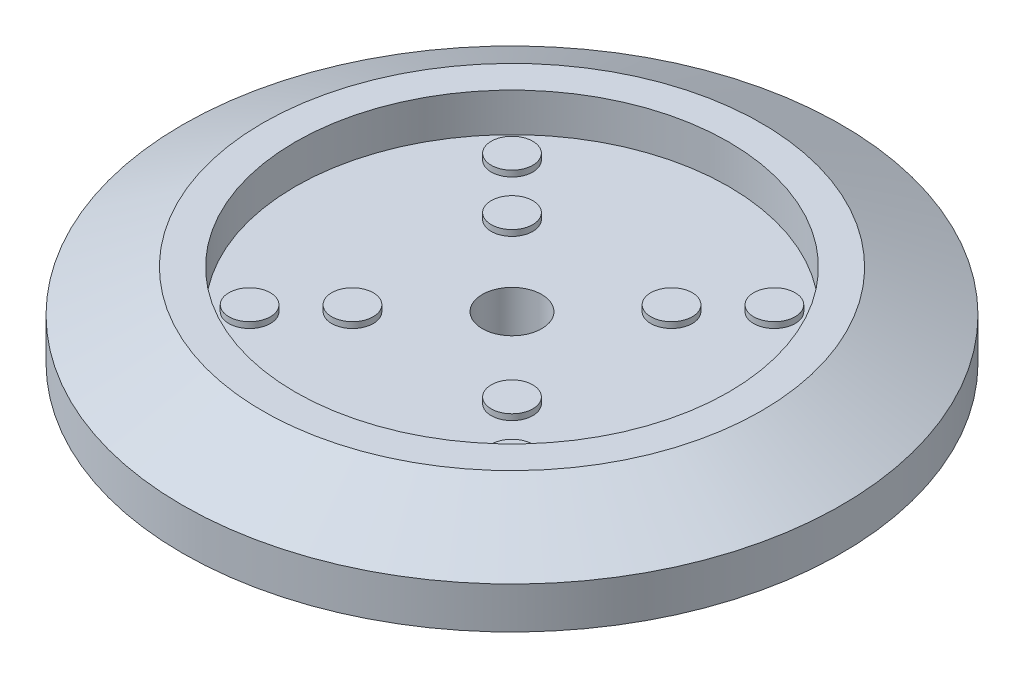
ISO-10303-21;
HEADER;
FILE_DESCRIPTION(('STEP AP214'),'2;1');
FILE_NAME('part.step','',(''),(''),'','','');
FILE_SCHEMA(('AUTOMOTIVE_DESIGN { 1 0 10303 214 1 1 1 1 }'));
ENDSEC;
DATA;
#1=APPLICATION_CONTEXT('core data for automotive mechanical design processes');
#2=APPLICATION_PROTOCOL_DEFINITION('international standard','automotive_design',2000,#1);
#3=PRODUCT_CONTEXT('',#1,'mechanical');
#4=PRODUCT('Part','Part','',(#3));
#5=PRODUCT_RELATED_PRODUCT_CATEGORY('part','',(#4));
#6=PRODUCT_DEFINITION_FORMATION('','',#4);
#7=PRODUCT_DEFINITION_CONTEXT('part definition',#1,'design');
#8=PRODUCT_DEFINITION('design','',#6,#7);
#9=PRODUCT_DEFINITION_SHAPE('','',#8);
#10=(LENGTH_UNIT() NAMED_UNIT(*) SI_UNIT(.MILLI.,.METRE.));
#11=(NAMED_UNIT(*) PLANE_ANGLE_UNIT() SI_UNIT($,.RADIAN.));
#12=(NAMED_UNIT(*) SI_UNIT($,.STERADIAN.) SOLID_ANGLE_UNIT());
#13=UNCERTAINTY_MEASURE_WITH_UNIT(LENGTH_MEASURE(1.E-05),#10,'distance_accuracy_value','');
#14=(GEOMETRIC_REPRESENTATION_CONTEXT(3) GLOBAL_UNCERTAINTY_ASSIGNED_CONTEXT((#13)) GLOBAL_UNIT_ASSIGNED_CONTEXT((#10,
#11,#12)) REPRESENTATION_CONTEXT('',''));
#15=CARTESIAN_POINT('',(0.,0.,0.));
#16=DIRECTION('',(0.,0.,1.));
#17=DIRECTION('',(1.,0.,0.));
#18=AXIS2_PLACEMENT_3D('',#15,#16,#17);
#19=CARTESIAN_POINT('',(-43.,832.,-1.62382802516848E-13));
#20=DIRECTION('',(0.,1.,0.));
#21=DIRECTION('',(-1.,0.,0.));
#22=AXIS2_PLACEMENT_3D('',#19,#20,#21);
#23=PLANE('',#22);
#24=CARTESIAN_POINT('',(-43.,832.,-1.62382802516848E-13));
#25=DIRECTION('',(0.,1.,0.));
#26=DIRECTION('',(-1.,0.,0.));
#27=AXIS2_PLACEMENT_3D('',#24,#25,#26);
#28=CIRCLE('',#27,73.);
#29=CARTESIAN_POINT('',(-116.,832.,-1.91048898287272E-13));
#30=VERTEX_POINT('',#29);
#31=EDGE_CURVE('E52',#30,#30,#28,.T.);
#32=ORIENTED_EDGE('',*,*,#31,.T.);
#33=EDGE_LOOP('',(#32));
#34=FACE_BOUND('',#33,.T.);
#35=CARTESIAN_POINT('',(-87.1941738241596,832.,44.1941738241592));
#36=DIRECTION('',(0.,1.,0.));
#37=DIRECTION('',(-1.,0.,0.));
#38=AXIS2_PLACEMENT_3D('',#35,#36,#37);
#39=CIRCLE('',#38,7.);
#40=CARTESIAN_POINT('',(-94.1941738241596,832.,44.1941738241592));
#41=VERTEX_POINT('',#40);
#42=EDGE_CURVE('E44',#41,#41,#39,.T.);
#43=ORIENTED_EDGE('',*,*,#42,.F.);
#44=EDGE_LOOP('',(#43));
#45=FACE_BOUND('',#44,.T.);
#46=CARTESIAN_POINT('',(1.19417382415923,832.,44.1941738241593));
#47=DIRECTION('',(0.,1.,0.));
#48=DIRECTION('',(-1.,0.,0.));
#49=AXIS2_PLACEMENT_3D('',#46,#47,#48);
#50=CIRCLE('',#49,7.);
#51=CARTESIAN_POINT('',(-5.80582617584077,832.,44.1941738241593));
#52=VERTEX_POINT('',#51);
#53=EDGE_CURVE('E41',#52,#52,#50,.T.);
#54=ORIENTED_EDGE('',*,*,#53,.F.);
#55=EDGE_LOOP('',(#54));
#56=FACE_BOUND('',#55,.T.);
#57=CARTESIAN_POINT('',(1.19417382415928,832.,-44.1941738241595));
#58=DIRECTION('',(0.,1.,0.));
#59=DIRECTION('',(-1.,0.,0.));
#60=AXIS2_PLACEMENT_3D('',#57,#58,#59);
#61=CIRCLE('',#60,7.);
#62=CARTESIAN_POINT('',(-5.80582617584072,832.,-44.1941738241595));
#63=VERTEX_POINT('',#62);
#64=EDGE_CURVE('E38',#63,#63,#61,.T.);
#65=ORIENTED_EDGE('',*,*,#64,.F.);
#66=EDGE_LOOP('',(#65));
#67=FACE_BOUND('',#66,.T.);
#68=CARTESIAN_POINT('',(-87.1941738241595,832.,-44.1941738241596));
#69=DIRECTION('',(0.,1.,0.));
#70=DIRECTION('',(-1.,0.,0.));
#71=AXIS2_PLACEMENT_3D('',#68,#69,#70);
#72=CIRCLE('',#71,7.);
#73=CARTESIAN_POINT('',(-94.1941738241595,832.,-44.1941738241596));
#74=VERTEX_POINT('',#73);
#75=EDGE_CURVE('E35',#74,#74,#72,.T.);
#76=ORIENTED_EDGE('',*,*,#75,.F.);
#77=EDGE_LOOP('',(#76));
#78=FACE_BOUND('',#77,.T.);
#79=CARTESIAN_POINT('',(-69.8700576850891,832.,26.8700576850887));
#80=DIRECTION('',(0.,1.,0.));
#81=DIRECTION('',(-1.,0.,0.));
#82=AXIS2_PLACEMENT_3D('',#79,#80,#81);
#83=CIRCLE('',#82,7.);
#84=CARTESIAN_POINT('',(-76.8700576850891,832.,26.8700576850887));
#85=VERTEX_POINT('',#84);
#86=EDGE_CURVE('E30',#85,#85,#83,.T.);
#87=ORIENTED_EDGE('',*,*,#86,.F.);
#88=EDGE_LOOP('',(#87));
#89=FACE_BOUND('',#88,.T.);
#90=CARTESIAN_POINT('',(-16.1299423149112,832.,26.8700576850887));
#91=DIRECTION('',(0.,1.,0.));
#92=DIRECTION('',(-1.,0.,0.));
#93=AXIS2_PLACEMENT_3D('',#90,#91,#92);
#94=CIRCLE('',#93,7.);
#95=CARTESIAN_POINT('',(-23.1299423149112,832.,26.8700576850887));
#96=VERTEX_POINT('',#95);
#97=EDGE_CURVE('E26',#96,#96,#94,.T.);
#98=ORIENTED_EDGE('',*,*,#97,.F.);
#99=EDGE_LOOP('',(#98));
#100=FACE_BOUND('',#99,.T.);
#101=CARTESIAN_POINT('',(-16.1299423149112,832.,-26.8700576850891));
#102=DIRECTION('',(0.,1.,0.));
#103=DIRECTION('',(-1.,0.,0.));
#104=AXIS2_PLACEMENT_3D('',#101,#102,#103);
#105=CIRCLE('',#104,7.);
#106=CARTESIAN_POINT('',(-23.1299423149112,832.,-26.8700576850891));
#107=VERTEX_POINT('',#106);
#108=EDGE_CURVE('E22',#107,#107,#105,.T.);
#109=ORIENTED_EDGE('',*,*,#108,.F.);
#110=EDGE_LOOP('',(#109));
#111=FACE_BOUND('',#110,.T.);
#112=CARTESIAN_POINT('',(-69.870057685089,832.,-26.8700576850891));
#113=DIRECTION('',(0.,1.,0.));
#114=DIRECTION('',(-1.,0.,0.));
#115=AXIS2_PLACEMENT_3D('',#112,#113,#114);
#116=CIRCLE('',#115,7.);
#117=CARTESIAN_POINT('',(-76.870057685089,832.,-26.8700576850891));
#118=VERTEX_POINT('',#117);
#119=EDGE_CURVE('E10',#118,#118,#116,.T.);
#120=ORIENTED_EDGE('',*,*,#119,.F.);
#121=EDGE_LOOP('',(#120));
#122=FACE_BOUND('',#121,.T.);
#123=CARTESIAN_POINT('',(-43.,832.,-1.68995676827488E-13));
#124=DIRECTION('',(0.,1.,0.));
#125=DIRECTION('',(-1.,0.,0.));
#126=AXIS2_PLACEMENT_3D('',#123,#124,#125);
#127=CIRCLE('',#126,10.);
#128=CARTESIAN_POINT('',(-53.,832.,-1.68995676827488E-13));
#129=VERTEX_POINT('',#128);
#130=EDGE_CURVE('E86',#129,#129,#127,.F.);
#131=ORIENTED_EDGE('',*,*,#130,.T.);
#132=EDGE_LOOP('',(#131));
#133=FACE_BOUND('',#132,.T.);
#134=ADVANCED_FACE('F15',(#34,#45,#56,#67,#78,#89,#100,#111,#122,#133),#23,.T.);
#135=CARTESIAN_POINT('',(-43.,845.,-1.62382802516847E-13));
#136=DIRECTION('',(0.,1.,0.));
#137=DIRECTION('',(-1.,0.,0.));
#138=AXIS2_PLACEMENT_3D('',#135,#136,#137);
#139=PLANE('',#138);
#140=CARTESIAN_POINT('',(-43.,845.,-1.62382802516847E-13));
#141=DIRECTION('',(0.,1.,0.));
#142=DIRECTION('',(-1.,0.,0.));
#143=AXIS2_PLACEMENT_3D('',#140,#141,#142);
#144=CIRCLE('',#143,84.);
#145=CARTESIAN_POINT('',(-127.,845.,-1.62382802516847E-13));
#146=VERTEX_POINT('',#145);
#147=EDGE_CURVE('E51',#146,#146,#144,.T.);
#148=ORIENTED_EDGE('',*,*,#147,.T.);
#149=EDGE_LOOP('',(#148));
#150=FACE_BOUND('',#149,.T.);
#151=CARTESIAN_POINT('',(-43.,845.,-1.62382802516848E-13));
#152=DIRECTION('',(0.,1.,0.));
#153=DIRECTION('',(-1.,0.,0.));
#154=AXIS2_PLACEMENT_3D('',#151,#152,#153);
#155=CIRCLE('',#154,73.);
#156=CARTESIAN_POINT('',(-116.,845.,-1.62382802516848E-13));
#157=VERTEX_POINT('',#156);
#158=EDGE_CURVE('E48',#157,#157,#155,.F.);
#159=ORIENTED_EDGE('',*,*,#158,.T.);
#160=EDGE_LOOP('',(#159));
#161=FACE_BOUND('',#160,.T.);
#162=ADVANCED_FACE('F110',(#150,#161),#139,.T.);
#163=CARTESIAN_POINT('',(-43.,845.,-1.62382802516847E-13));
#164=DIRECTION('',(0.,-1.,0.));
#165=DIRECTION('',(1.,0.,0.));
#166=AXIS2_PLACEMENT_3D('',#163,#164,#165);
#167=CYLINDRICAL_SURFACE('',#166,111.);
#168=CARTESIAN_POINT('',(-43.,817.,-1.62382802516847E-13));
#169=DIRECTION('',(0.,1.,0.));
#170=DIRECTION('',(-1.,0.,0.));
#171=AXIS2_PLACEMENT_3D('',#168,#169,#170);
#172=CIRCLE('',#171,111.);
#173=CARTESIAN_POINT('',(-154.,817.,-1.62382802516847E-13));
#174=VERTEX_POINT('',#173);
#175=EDGE_CURVE('E83',#174,#174,#172,.T.);
#176=ORIENTED_EDGE('',*,*,#175,.T.);
#177=EDGE_LOOP('',(#176));
#178=FACE_BOUND('',#177,.T.);
#179=CARTESIAN_POINT('',(-43.,831.,-1.62382802516847E-13));
#180=DIRECTION('',(0.,1.,0.));
#181=DIRECTION('',(0.,0.,1.));
#182=AXIS2_PLACEMENT_3D('',#179,#180,#181);
#183=CIRCLE('',#182,111.);
#184=CARTESIAN_POINT('',(-43.,831.,111.));
#185=VERTEX_POINT('',#184);
#186=EDGE_CURVE('E47',#185,#185,#183,.F.);
#187=ORIENTED_EDGE('',*,*,#186,.T.);
#188=EDGE_LOOP('',(#187));
#189=FACE_BOUND('',#188,.T.);
#190=ADVANCED_FACE('F17',(#178,#189),#167,.T.);
#191=CARTESIAN_POINT('',(-43.,845.,-1.62382802516847E-13));
#192=DIRECTION('',(0.,-1.,0.));
#193=DIRECTION('',(0.,0.,-1.));
#194=AXIS2_PLACEMENT_3D('',#191,#192,#193);
#195=CONICAL_SURFACE('',#194,84.,1.09244389541624);
#196=ORIENTED_EDGE('',*,*,#186,.F.);
#197=EDGE_LOOP('',(#196));
#198=FACE_BOUND('',#197,.T.);
#199=ORIENTED_EDGE('',*,*,#147,.F.);
#200=EDGE_LOOP('',(#199));
#201=FACE_BOUND('',#200,.T.);
#202=ADVANCED_FACE('F109',(#198,#201),#195,.T.);
#203=CARTESIAN_POINT('',(-43.,1149.45393366597,-1.62382802516848E-13));
#204=DIRECTION('',(0.,-1.,0.));
#205=DIRECTION('',(1.,0.,0.));
#206=AXIS2_PLACEMENT_3D('',#203,#204,#205);
#207=CYLINDRICAL_SURFACE('',#206,73.);
#208=ORIENTED_EDGE('',*,*,#158,.F.);
#209=EDGE_LOOP('',(#208));
#210=FACE_BOUND('',#209,.T.);
#211=ORIENTED_EDGE('',*,*,#31,.F.);
#212=EDGE_LOOP('',(#211));
#213=FACE_BOUND('',#212,.T.);
#214=ADVANCED_FACE('F115',(#210,#213),#207,.F.);
#215=CARTESIAN_POINT('',(-87.1941738241596,516.546066334029,44.1941738241592));
#216=DIRECTION('',(0.,1.,0.));
#217=DIRECTION('',(-0.707106781186548,0.,0.707106781186546));
#218=AXIS2_PLACEMENT_3D('',#215,#216,#217);
#219=CYLINDRICAL_SURFACE('',#218,7.);
#220=ORIENTED_EDGE('',*,*,#42,.T.);
#221=EDGE_LOOP('',(#220));
#222=FACE_BOUND('',#221,.T.);
#223=CARTESIAN_POINT('',(-87.1941738241596,834.,44.1941738241592));
#224=DIRECTION('',(0.,1.,0.));
#225=DIRECTION('',(-0.707106781186548,0.,0.707106781186546));
#226=AXIS2_PLACEMENT_3D('',#223,#224,#225);
#227=CIRCLE('',#226,7.);
#228=CARTESIAN_POINT('',(-92.1439212924654,834.,49.143921292465));
#229=VERTEX_POINT('',#228);
#230=EDGE_CURVE('E59',#229,#229,#227,.T.);
#231=ORIENTED_EDGE('',*,*,#230,.F.);
#232=EDGE_LOOP('',(#231));
#233=FACE_BOUND('',#232,.T.);
#234=ADVANCED_FACE('F125',(#222,#233),#219,.T.);
#235=CARTESIAN_POINT('',(-87.1941738241596,834.,44.1941738241592));
#236=DIRECTION('',(0.,1.,0.));
#237=DIRECTION('',(-0.707106781186548,0.,0.707106781186546));
#238=AXIS2_PLACEMENT_3D('',#235,#236,#237);
#239=PLANE('',#238);
#240=ORIENTED_EDGE('',*,*,#230,.T.);
#241=EDGE_LOOP('',(#240));
#242=FACE_BOUND('',#241,.T.);
#243=ADVANCED_FACE('F195',(#242),#239,.T.);
#244=CARTESIAN_POINT('',(1.19417382415923,516.546066334029,44.1941738241593));
#245=DIRECTION('',(0.,1.,0.));
#246=DIRECTION('',(0.707106781186546,0.,0.707106781186548));
#247=AXIS2_PLACEMENT_3D('',#244,#245,#246);
#248=CYLINDRICAL_SURFACE('',#247,7.);
#249=ORIENTED_EDGE('',*,*,#53,.T.);
#250=EDGE_LOOP('',(#249));
#251=FACE_BOUND('',#250,.T.);
#252=CARTESIAN_POINT('',(1.19417382415923,834.,44.1941738241593));
#253=DIRECTION('',(0.,1.,0.));
#254=DIRECTION('',(0.707106781186546,0.,0.707106781186548));
#255=AXIS2_PLACEMENT_3D('',#252,#253,#254);
#256=CIRCLE('',#255,7.);
#257=CARTESIAN_POINT('',(6.14392129246506,834.,49.1439212924651));
#258=VERTEX_POINT('',#257);
#259=EDGE_CURVE('E62',#258,#258,#256,.T.);
#260=ORIENTED_EDGE('',*,*,#259,.F.);
#261=EDGE_LOOP('',(#260));
#262=FACE_BOUND('',#261,.T.);
#263=ADVANCED_FACE('F191',(#251,#262),#248,.T.);
#264=CARTESIAN_POINT('',(1.19417382415923,834.,44.1941738241593));
#265=DIRECTION('',(0.,1.,0.));
#266=DIRECTION('',(0.707106781186546,0.,0.707106781186548));
#267=AXIS2_PLACEMENT_3D('',#264,#265,#266);
#268=PLANE('',#267);
#269=ORIENTED_EDGE('',*,*,#259,.T.);
#270=EDGE_LOOP('',(#269));
#271=FACE_BOUND('',#270,.T.);
#272=ADVANCED_FACE('F187',(#271),#268,.T.);
#273=CARTESIAN_POINT('',(1.19417382415927,516.546066334029,-44.1941738241595));
#274=DIRECTION('',(0.,1.,0.));
#275=DIRECTION('',(0.707106781186549,0.,-0.707106781186546));
#276=AXIS2_PLACEMENT_3D('',#273,#274,#275);
#277=CYLINDRICAL_SURFACE('',#276,7.);
#278=ORIENTED_EDGE('',*,*,#64,.T.);
#279=EDGE_LOOP('',(#278));
#280=FACE_BOUND('',#279,.T.);
#281=CARTESIAN_POINT('',(1.19417382415929,834.,-44.1941738241595));
#282=DIRECTION('',(0.,1.,0.));
#283=DIRECTION('',(0.707106781186548,0.,-0.707106781186546));
#284=AXIS2_PLACEMENT_3D('',#281,#282,#283);
#285=CIRCLE('',#284,7.);
#286=CARTESIAN_POINT('',(6.14392129246513,834.,-49.1439212924654));
#287=VERTEX_POINT('',#286);
#288=EDGE_CURVE('E65',#287,#287,#285,.T.);
#289=ORIENTED_EDGE('',*,*,#288,.F.);
#290=EDGE_LOOP('',(#289));
#291=FACE_BOUND('',#290,.T.);
#292=ADVANCED_FACE('F183',(#280,#291),#277,.T.);
#293=CARTESIAN_POINT('',(1.19417382415929,834.,-44.1941738241595));
#294=DIRECTION('',(0.,1.,0.));
#295=DIRECTION('',(0.707106781186549,0.,-0.707106781186546));
#296=AXIS2_PLACEMENT_3D('',#293,#294,#295);
#297=PLANE('',#296);
#298=ORIENTED_EDGE('',*,*,#288,.T.);
#299=EDGE_LOOP('',(#298));
#300=FACE_BOUND('',#299,.T.);
#301=ADVANCED_FACE('F179',(#300),#297,.T.);
#302=CARTESIAN_POINT('',(-87.1941738241595,516.546066334029,-44.1941738241596));
#303=DIRECTION('',(0.,1.,0.));
#304=DIRECTION('',(-0.707106781186546,0.,-0.707106781186549));
#305=AXIS2_PLACEMENT_3D('',#302,#303,#304);
#306=CYLINDRICAL_SURFACE('',#305,7.);
#307=ORIENTED_EDGE('',*,*,#75,.T.);
#308=EDGE_LOOP('',(#307));
#309=FACE_BOUND('',#308,.T.);
#310=CARTESIAN_POINT('',(-87.1941738241595,834.,-44.1941738241596));
#311=DIRECTION('',(0.,1.,0.));
#312=DIRECTION('',(-0.707106781186546,0.,-0.707106781186548));
#313=AXIS2_PLACEMENT_3D('',#310,#311,#312);
#314=CIRCLE('',#313,7.);
#315=CARTESIAN_POINT('',(-92.1439212924653,834.,-49.1439212924654));
#316=VERTEX_POINT('',#315);
#317=EDGE_CURVE('E68',#316,#316,#314,.T.);
#318=ORIENTED_EDGE('',*,*,#317,.F.);
#319=EDGE_LOOP('',(#318));
#320=FACE_BOUND('',#319,.T.);
#321=ADVANCED_FACE('F175',(#309,#320),#306,.T.);
#322=CARTESIAN_POINT('',(-87.1941738241595,834.,-44.1941738241596));
#323=DIRECTION('',(0.,1.,0.));
#324=DIRECTION('',(-0.707106781186546,0.,-0.707106781186549));
#325=AXIS2_PLACEMENT_3D('',#322,#323,#324);
#326=PLANE('',#325);
#327=ORIENTED_EDGE('',*,*,#317,.T.);
#328=EDGE_LOOP('',(#327));
#329=FACE_BOUND('',#328,.T.);
#330=ADVANCED_FACE('F171',(#329),#326,.T.);
#331=CARTESIAN_POINT('',(-69.8700576850891,516.546066334029,26.8700576850887));
#332=DIRECTION('',(0.,1.,0.));
#333=DIRECTION('',(-0.707106781186548,0.,0.707106781186546));
#334=AXIS2_PLACEMENT_3D('',#331,#332,#333);
#335=CYLINDRICAL_SURFACE('',#334,7.);
#336=ORIENTED_EDGE('',*,*,#86,.T.);
#337=EDGE_LOOP('',(#336));
#338=FACE_BOUND('',#337,.T.);
#339=CARTESIAN_POINT('',(-69.8700576850891,834.,26.8700576850887));
#340=DIRECTION('',(0.,1.,0.));
#341=DIRECTION('',(-0.707106781186548,0.,0.707106781186546));
#342=AXIS2_PLACEMENT_3D('',#339,#340,#341);
#343=CIRCLE('',#342,7.);
#344=CARTESIAN_POINT('',(-74.8198051533949,834.,31.8198051533946));
#345=VERTEX_POINT('',#344);
#346=EDGE_CURVE('E71',#345,#345,#343,.T.);
#347=ORIENTED_EDGE('',*,*,#346,.F.);
#348=EDGE_LOOP('',(#347));
#349=FACE_BOUND('',#348,.T.);
#350=ADVANCED_FACE('F167',(#338,#349),#335,.T.);
#351=CARTESIAN_POINT('',(-69.8700576850891,834.,26.8700576850887));
#352=DIRECTION('',(0.,1.,0.));
#353=DIRECTION('',(-0.707106781186548,0.,0.707106781186546));
#354=AXIS2_PLACEMENT_3D('',#351,#352,#353);
#355=PLANE('',#354);
#356=ORIENTED_EDGE('',*,*,#346,.T.);
#357=EDGE_LOOP('',(#356));
#358=FACE_BOUND('',#357,.T.);
#359=ADVANCED_FACE('F150',(#358),#355,.T.);
#360=CARTESIAN_POINT('',(-16.1299423149112,516.546066334029,26.8700576850887));
#361=DIRECTION('',(0.,1.,0.));
#362=DIRECTION('',(0.707106781186546,0.,0.707106781186548));
#363=AXIS2_PLACEMENT_3D('',#360,#361,#362);
#364=CYLINDRICAL_SURFACE('',#363,7.);
#365=ORIENTED_EDGE('',*,*,#97,.T.);
#366=EDGE_LOOP('',(#365));
#367=FACE_BOUND('',#366,.T.);
#368=CARTESIAN_POINT('',(-16.1299423149112,834.,26.8700576850888));
#369=DIRECTION('',(0.,1.,0.));
#370=DIRECTION('',(0.707106781186546,0.,0.707106781186548));
#371=AXIS2_PLACEMENT_3D('',#368,#369,#370);
#372=CIRCLE('',#371,7.);
#373=CARTESIAN_POINT('',(-11.1801948466054,834.,31.8198051533946));
#374=VERTEX_POINT('',#373);
#375=EDGE_CURVE('E74',#374,#374,#372,.T.);
#376=ORIENTED_EDGE('',*,*,#375,.F.);
#377=EDGE_LOOP('',(#376));
#378=FACE_BOUND('',#377,.T.);
#379=ADVANCED_FACE('F146',(#367,#378),#364,.T.);
#380=CARTESIAN_POINT('',(-16.1299423149112,834.,26.8700576850888));
#381=DIRECTION('',(0.,1.,0.));
#382=DIRECTION('',(0.707106781186546,0.,0.707106781186548));
#383=AXIS2_PLACEMENT_3D('',#380,#381,#382);
#384=PLANE('',#383);
#385=ORIENTED_EDGE('',*,*,#375,.T.);
#386=EDGE_LOOP('',(#385));
#387=FACE_BOUND('',#386,.T.);
#388=ADVANCED_FACE('F149',(#387),#384,.T.);
#389=CARTESIAN_POINT('',(-16.1299423149112,516.546066334029,-26.8700576850891));
#390=DIRECTION('',(0.,1.,0.));
#391=DIRECTION('',(0.707106781186549,0.,-0.707106781186546));
#392=AXIS2_PLACEMENT_3D('',#389,#390,#391);
#393=CYLINDRICAL_SURFACE('',#392,7.);
#394=ORIENTED_EDGE('',*,*,#108,.T.);
#395=EDGE_LOOP('',(#394));
#396=FACE_BOUND('',#395,.T.);
#397=CARTESIAN_POINT('',(-16.1299423149112,834.,-26.8700576850891));
#398=DIRECTION('',(0.,1.,0.));
#399=DIRECTION('',(0.707106781186548,0.,-0.707106781186546));
#400=AXIS2_PLACEMENT_3D('',#397,#398,#399);
#401=CIRCLE('',#400,7.);
#402=CARTESIAN_POINT('',(-11.1801948466054,834.,-31.8198051533949));
#403=VERTEX_POINT('',#402);
#404=EDGE_CURVE('E77',#403,#403,#401,.T.);
#405=ORIENTED_EDGE('',*,*,#404,.F.);
#406=EDGE_LOOP('',(#405));
#407=FACE_BOUND('',#406,.T.);
#408=ADVANCED_FACE('F155',(#396,#407),#393,.T.);
#409=CARTESIAN_POINT('',(-16.1299423149112,834.,-26.8700576850891));
#410=DIRECTION('',(0.,1.,0.));
#411=DIRECTION('',(0.707106781186549,0.,-0.707106781186546));
#412=AXIS2_PLACEMENT_3D('',#409,#410,#411);
#413=PLANE('',#412);
#414=ORIENTED_EDGE('',*,*,#404,.T.);
#415=EDGE_LOOP('',(#414));
#416=FACE_BOUND('',#415,.T.);
#417=ADVANCED_FACE('F161',(#416),#413,.T.);
#418=CARTESIAN_POINT('',(-69.8700576850891,516.546066334029,-26.8700576850891));
#419=DIRECTION('',(0.,1.,0.));
#420=DIRECTION('',(-0.707106781186546,0.,-0.707106781186549));
#421=AXIS2_PLACEMENT_3D('',#418,#419,#420);
#422=CYLINDRICAL_SURFACE('',#421,7.);
#423=ORIENTED_EDGE('',*,*,#119,.T.);
#424=EDGE_LOOP('',(#423));
#425=FACE_BOUND('',#424,.T.);
#426=CARTESIAN_POINT('',(-69.870057685089,834.,-26.8700576850891));
#427=DIRECTION('',(0.,1.,0.));
#428=DIRECTION('',(-0.707106781186546,0.,-0.707106781186548));
#429=AXIS2_PLACEMENT_3D('',#426,#427,#428);
#430=CIRCLE('',#429,7.);
#431=CARTESIAN_POINT('',(-74.8198051533948,834.,-31.8198051533949));
#432=VERTEX_POINT('',#431);
#433=EDGE_CURVE('E80',#432,#432,#430,.T.);
#434=ORIENTED_EDGE('',*,*,#433,.F.);
#435=EDGE_LOOP('',(#434));
#436=FACE_BOUND('',#435,.T.);
#437=ADVANCED_FACE('F284',(#425,#436),#422,.T.);
#438=CARTESIAN_POINT('',(-69.870057685089,834.,-26.8700576850891));
#439=DIRECTION('',(0.,1.,0.));
#440=DIRECTION('',(-0.707106781186546,0.,-0.707106781186549));
#441=AXIS2_PLACEMENT_3D('',#438,#439,#440);
#442=PLANE('',#441);
#443=ORIENTED_EDGE('',*,*,#433,.T.);
#444=EDGE_LOOP('',(#443));
#445=FACE_BOUND('',#444,.T.);
#446=ADVANCED_FACE('F103',(#445),#442,.T.);
#447=CARTESIAN_POINT('',(-43.,817.,-1.62382802516847E-13));
#448=DIRECTION('',(0.,1.,0.));
#449=DIRECTION('',(-1.,0.,0.));
#450=AXIS2_PLACEMENT_3D('',#447,#448,#449);
#451=PLANE('',#450);
#452=CARTESIAN_POINT('',(-43.,817.,-1.68995676827488E-13));
#453=DIRECTION('',(0.,1.,0.));
#454=DIRECTION('',(-1.,0.,0.));
#455=AXIS2_PLACEMENT_3D('',#452,#453,#454);
#456=CIRCLE('',#455,10.);
#457=CARTESIAN_POINT('',(-53.,817.,-1.68995676827488E-13));
#458=VERTEX_POINT('',#457);
#459=EDGE_CURVE('E87',#458,#458,#456,.T.);
#460=ORIENTED_EDGE('',*,*,#459,.T.);
#461=EDGE_LOOP('',(#460));
#462=FACE_BOUND('',#461,.T.);
#463=ORIENTED_EDGE('',*,*,#175,.F.);
#464=EDGE_LOOP('',(#463));
#465=FACE_BOUND('',#464,.T.);
#466=ADVANCED_FACE('F97',(#462,#465),#451,.F.);
#467=CARTESIAN_POINT('',(-43.,1466.90786733195,-1.68995676827488E-13));
#468=DIRECTION('',(0.,-1.,0.));
#469=DIRECTION('',(1.,0.,0.));
#470=AXIS2_PLACEMENT_3D('',#467,#468,#469);
#471=CYLINDRICAL_SURFACE('',#470,10.);
#472=ORIENTED_EDGE('',*,*,#130,.F.);
#473=EDGE_LOOP('',(#472));
#474=FACE_BOUND('',#473,.T.);
#475=ORIENTED_EDGE('',*,*,#459,.F.);
#476=EDGE_LOOP('',(#475));
#477=FACE_BOUND('',#476,.T.);
#478=ADVANCED_FACE('F94',(#474,#477),#471,.F.);
#479=CLOSED_SHELL('',(#134,#162,#190,#202,#214,#234,#243,#263,#272,#292,#301,#321,#330,#350,
#359,#379,#388,#408,#417,#437,#446,#466,#478));
#480=MANIFOLD_SOLID_BREP('B1',#479);
#481=ADVANCED_BREP_SHAPE_REPRESENTATION('',(#18,#480),#14);
#482=SHAPE_DEFINITION_REPRESENTATION(#9,#481);
ENDSEC;
END-ISO-10303-21;
